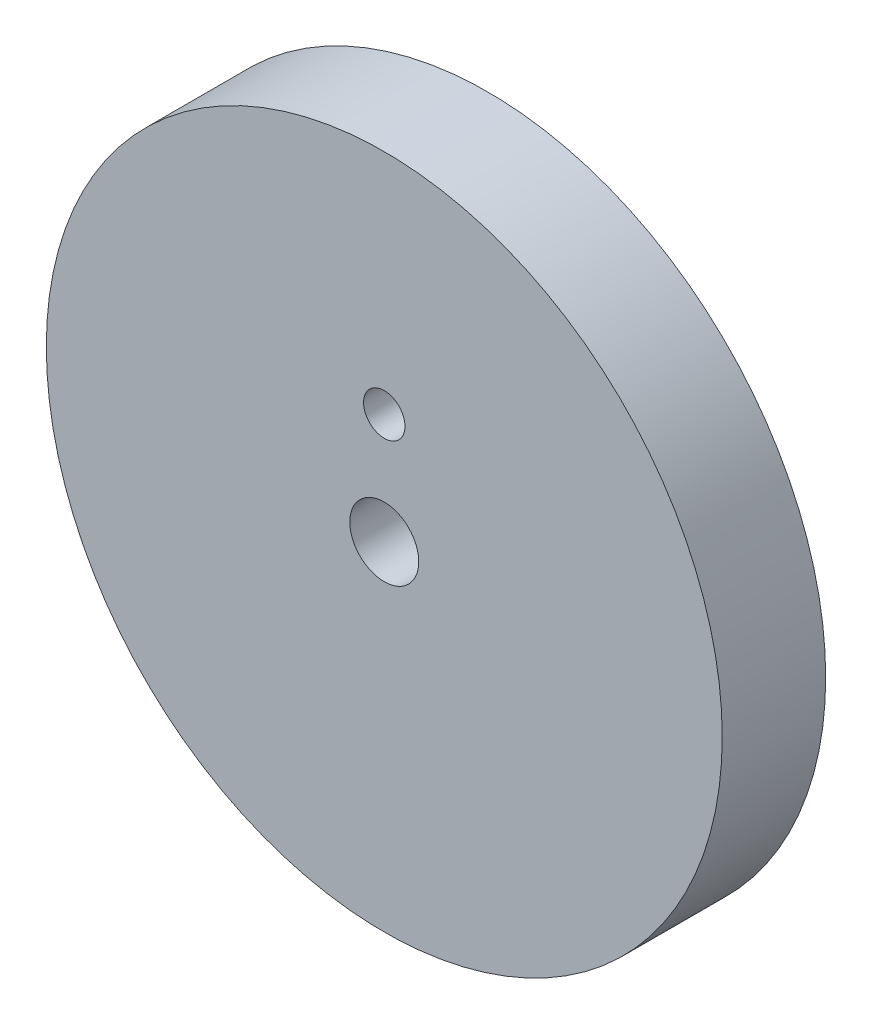
ISO-10303-21;
HEADER;
FILE_DESCRIPTION(('STEP AP214'),'2;1');
FILE_NAME('part.step','',(''),(''),'','','');
FILE_SCHEMA(('AUTOMOTIVE_DESIGN { 1 0 10303 214 1 1 1 1 }'));
ENDSEC;
DATA;
#1=APPLICATION_CONTEXT('core data for automotive mechanical design processes');
#2=APPLICATION_PROTOCOL_DEFINITION('international standard','automotive_design',2000,#1);
#3=PRODUCT_CONTEXT('',#1,'mechanical');
#4=PRODUCT('Part','Part','',(#3));
#5=PRODUCT_RELATED_PRODUCT_CATEGORY('part','',(#4));
#6=PRODUCT_DEFINITION_FORMATION('','',#4);
#7=PRODUCT_DEFINITION_CONTEXT('part definition',#1,'design');
#8=PRODUCT_DEFINITION('design','',#6,#7);
#9=PRODUCT_DEFINITION_SHAPE('','',#8);
#10=(LENGTH_UNIT() NAMED_UNIT(*) SI_UNIT(.MILLI.,.METRE.));
#11=(NAMED_UNIT(*) PLANE_ANGLE_UNIT() SI_UNIT($,.RADIAN.));
#12=(NAMED_UNIT(*) SI_UNIT($,.STERADIAN.) SOLID_ANGLE_UNIT());
#13=UNCERTAINTY_MEASURE_WITH_UNIT(LENGTH_MEASURE(1.E-05),#10,'distance_accuracy_value','');
#14=(GEOMETRIC_REPRESENTATION_CONTEXT(3) GLOBAL_UNCERTAINTY_ASSIGNED_CONTEXT((#13)) GLOBAL_UNIT_ASSIGNED_CONTEXT((#10,
#11,#12)) REPRESENTATION_CONTEXT('',''));
#15=CARTESIAN_POINT('',(0.,0.,0.));
#16=DIRECTION('',(0.,0.,1.));
#17=DIRECTION('',(1.,0.,0.));
#18=AXIS2_PLACEMENT_3D('',#15,#16,#17);
#19=CARTESIAN_POINT('',(0.,0.,15.));
#20=DIRECTION('',(0.,0.,-1.));
#21=DIRECTION('',(-1.,0.,0.));
#22=AXIS2_PLACEMENT_3D('',#19,#20,#21);
#23=CYLINDRICAL_SURFACE('',#22,49.);
#24=CARTESIAN_POINT('',(0.,0.,15.));
#25=DIRECTION('',(0.,0.,1.));
#26=DIRECTION('',(1.,0.,0.));
#27=AXIS2_PLACEMENT_3D('',#24,#25,#26);
#28=CIRCLE('',#27,49.);
#29=CARTESIAN_POINT('',(49.,0.,15.));
#30=VERTEX_POINT('',#29);
#31=EDGE_CURVE('E10',#30,#30,#28,.T.);
#32=ORIENTED_EDGE('',*,*,#31,.F.);
#33=EDGE_LOOP('',(#32));
#34=FACE_BOUND('',#33,.T.);
#35=CARTESIAN_POINT('',(0.,0.,0.));
#36=DIRECTION('',(0.,0.,1.));
#37=DIRECTION('',(1.,0.,0.));
#38=AXIS2_PLACEMENT_3D('',#35,#36,#37);
#39=CIRCLE('',#38,49.);
#40=CARTESIAN_POINT('',(49.,0.,0.));
#41=VERTEX_POINT('',#40);
#42=EDGE_CURVE('E34',#41,#41,#39,.T.);
#43=ORIENTED_EDGE('',*,*,#42,.T.);
#44=EDGE_LOOP('',(#43));
#45=FACE_BOUND('',#44,.T.);
#46=ADVANCED_FACE('F31',(#34,#45),#23,.T.);
#47=CARTESIAN_POINT('',(0.,0.,15.));
#48=DIRECTION('',(0.,0.,1.));
#49=DIRECTION('',(1.,0.,0.));
#50=AXIS2_PLACEMENT_3D('',#47,#48,#49);
#51=PLANE('',#50);
#52=CARTESIAN_POINT('',(0.,16.,15.));
#53=DIRECTION('',(0.,0.,-1.));
#54=DIRECTION('',(-1.,0.,0.));
#55=AXIS2_PLACEMENT_3D('',#52,#53,#54);
#56=CIRCLE('',#55,3.);
#57=CARTESIAN_POINT('',(-3.,16.,15.));
#58=VERTEX_POINT('',#57);
#59=EDGE_CURVE('E46',#58,#58,#56,.T.);
#60=ORIENTED_EDGE('',*,*,#59,.T.);
#61=EDGE_LOOP('',(#60));
#62=FACE_BOUND('',#61,.T.);
#63=CARTESIAN_POINT('',(0.,0.,15.));
#64=DIRECTION('',(0.,0.,-1.));
#65=DIRECTION('',(-1.,0.,0.));
#66=AXIS2_PLACEMENT_3D('',#63,#64,#65);
#67=CIRCLE('',#66,5.);
#68=CARTESIAN_POINT('',(-5.,0.,15.));
#69=VERTEX_POINT('',#68);
#70=EDGE_CURVE('E41',#69,#69,#67,.T.);
#71=ORIENTED_EDGE('',*,*,#70,.T.);
#72=EDGE_LOOP('',(#71));
#73=FACE_BOUND('',#72,.T.);
#74=ORIENTED_EDGE('',*,*,#31,.T.);
#75=EDGE_LOOP('',(#74));
#76=FACE_BOUND('',#75,.T.);
#77=ADVANCED_FACE('F55',(#62,#73,#76),#51,.T.);
#78=CARTESIAN_POINT('',(0.,0.,0.));
#79=DIRECTION('',(0.,0.,1.));
#80=DIRECTION('',(1.,0.,0.));
#81=AXIS2_PLACEMENT_3D('',#78,#79,#80);
#82=PLANE('',#81);
#83=CARTESIAN_POINT('',(0.,16.,0.));
#84=DIRECTION('',(0.,0.,-1.));
#85=DIRECTION('',(-1.,0.,0.));
#86=AXIS2_PLACEMENT_3D('',#83,#84,#85);
#87=CIRCLE('',#86,3.);
#88=CARTESIAN_POINT('',(-3.,16.,0.));
#89=VERTEX_POINT('',#88);
#90=EDGE_CURVE('E49',#89,#89,#87,.T.);
#91=ORIENTED_EDGE('',*,*,#90,.F.);
#92=EDGE_LOOP('',(#91));
#93=FACE_BOUND('',#92,.T.);
#94=CARTESIAN_POINT('',(0.,0.,0.));
#95=DIRECTION('',(0.,0.,-1.));
#96=DIRECTION('',(-1.,0.,0.));
#97=AXIS2_PLACEMENT_3D('',#94,#95,#96);
#98=CIRCLE('',#97,5.);
#99=CARTESIAN_POINT('',(-5.,0.,0.));
#100=VERTEX_POINT('',#99);
#101=EDGE_CURVE('E43',#100,#100,#98,.T.);
#102=ORIENTED_EDGE('',*,*,#101,.F.);
#103=EDGE_LOOP('',(#102));
#104=FACE_BOUND('',#103,.T.);
#105=ORIENTED_EDGE('',*,*,#42,.F.);
#106=EDGE_LOOP('',(#105));
#107=FACE_BOUND('',#106,.T.);
#108=ADVANCED_FACE('F65',(#93,#104,#107),#82,.F.);
#109=CARTESIAN_POINT('',(0.,0.,15.));
#110=DIRECTION('',(0.,0.,-1.));
#111=DIRECTION('',(-1.,0.,0.));
#112=AXIS2_PLACEMENT_3D('',#109,#110,#111);
#113=CYLINDRICAL_SURFACE('',#112,5.);
#114=ORIENTED_EDGE('',*,*,#70,.F.);
#115=EDGE_LOOP('',(#114));
#116=FACE_BOUND('',#115,.T.);
#117=ORIENTED_EDGE('',*,*,#101,.T.);
#118=EDGE_LOOP('',(#117));
#119=FACE_BOUND('',#118,.T.);
#120=ADVANCED_FACE('F61',(#116,#119),#113,.F.);
#121=CARTESIAN_POINT('',(0.,16.,15.));
#122=DIRECTION('',(0.,0.,-1.));
#123=DIRECTION('',(-1.,0.,0.));
#124=AXIS2_PLACEMENT_3D('',#121,#122,#123);
#125=CYLINDRICAL_SURFACE('',#124,3.);
#126=ORIENTED_EDGE('',*,*,#59,.F.);
#127=EDGE_LOOP('',(#126));
#128=FACE_BOUND('',#127,.T.);
#129=ORIENTED_EDGE('',*,*,#90,.T.);
#130=EDGE_LOOP('',(#129));
#131=FACE_BOUND('',#130,.T.);
#132=ADVANCED_FACE('F58',(#128,#131),#125,.F.);
#133=CLOSED_SHELL('',(#46,#77,#108,#120,#132));
#134=MANIFOLD_SOLID_BREP('B2',#133);
#135=ADVANCED_BREP_SHAPE_REPRESENTATION('',(#18,#134),#14);
#136=SHAPE_DEFINITION_REPRESENTATION(#9,#135);
ENDSEC;
END-ISO-10303-21;
